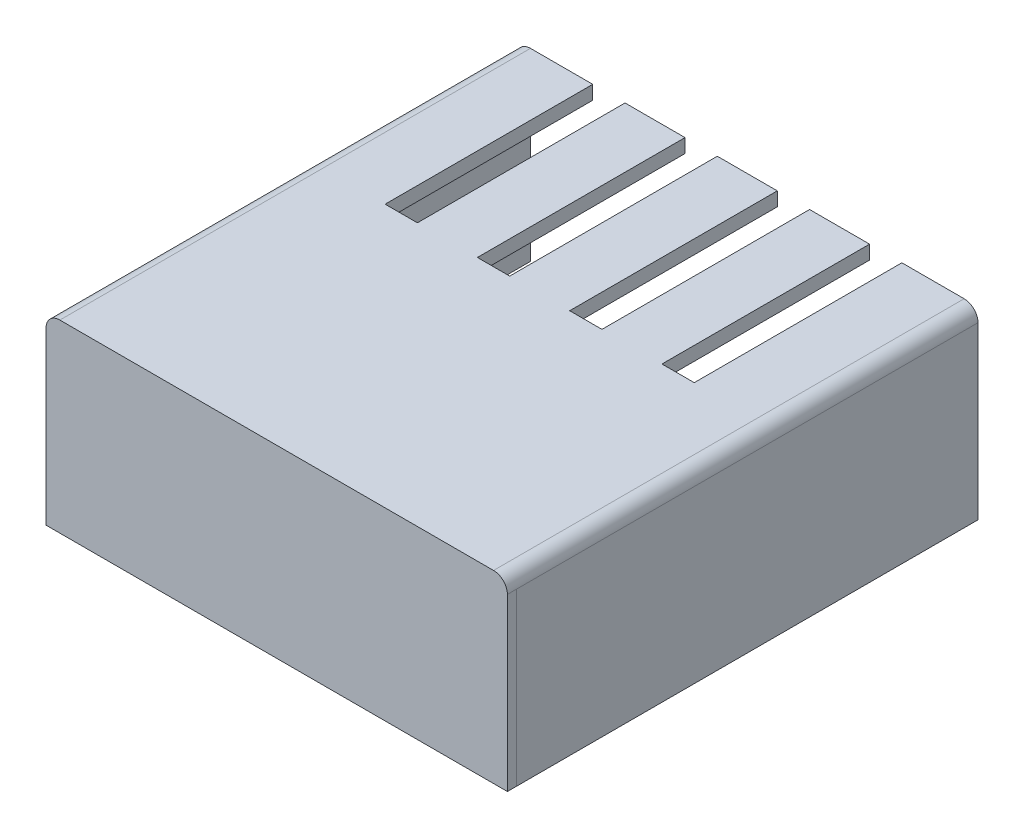
ISO-10303-21;
HEADER;
FILE_DESCRIPTION(('STEP AP214'),'2;1');
FILE_NAME('part.step','',(''),(''),'','','');
FILE_SCHEMA(('AUTOMOTIVE_DESIGN { 1 0 10303 214 1 1 1 1 }'));
ENDSEC;
DATA;
#1=APPLICATION_CONTEXT('core data for automotive mechanical design processes');
#2=APPLICATION_PROTOCOL_DEFINITION('international standard','automotive_design',2000,#1);
#3=PRODUCT_CONTEXT('',#1,'mechanical');
#4=PRODUCT('Part','Part','',(#3));
#5=PRODUCT_RELATED_PRODUCT_CATEGORY('part','',(#4));
#6=PRODUCT_DEFINITION_FORMATION('','',#4);
#7=PRODUCT_DEFINITION_CONTEXT('part definition',#1,'design');
#8=PRODUCT_DEFINITION('design','',#6,#7);
#9=PRODUCT_DEFINITION_SHAPE('','',#8);
#10=(LENGTH_UNIT() NAMED_UNIT(*) SI_UNIT(.MILLI.,.METRE.));
#11=(NAMED_UNIT(*) PLANE_ANGLE_UNIT() SI_UNIT($,.RADIAN.));
#12=(NAMED_UNIT(*) SI_UNIT($,.STERADIAN.) SOLID_ANGLE_UNIT());
#13=UNCERTAINTY_MEASURE_WITH_UNIT(LENGTH_MEASURE(1.E-05),#10,'distance_accuracy_value','');
#14=(GEOMETRIC_REPRESENTATION_CONTEXT(3) GLOBAL_UNCERTAINTY_ASSIGNED_CONTEXT((#13)) GLOBAL_UNIT_ASSIGNED_CONTEXT((#10,
#11,#12)) REPRESENTATION_CONTEXT('',''));
#15=CARTESIAN_POINT('',(0.,0.,0.));
#16=DIRECTION('',(0.,0.,1.));
#17=DIRECTION('',(1.,0.,0.));
#18=AXIS2_PLACEMENT_3D('',#15,#16,#17);
#19=CARTESIAN_POINT('',(47.,0.,30.));
#20=DIRECTION('',(0.,0.,1.));
#21=DIRECTION('',(1.,0.,0.));
#22=AXIS2_PLACEMENT_3D('',#19,#20,#21);
#23=PLANE('',#22);
#24=DIRECTION('',(0.,-1.,0.));
#25=VECTOR('',#24,1.);
#26=CARTESIAN_POINT('',(50.,0.,30.));
#27=LINE('',#26,#25);
#28=CARTESIAN_POINT('',(50.,0.,30.));
#29=VERTEX_POINT('',#28);
#30=CARTESIAN_POINT('',(50.,-37.,30.));
#31=VERTEX_POINT('',#30);
#32=EDGE_CURVE('E107',#29,#31,#27,.T.);
#33=ORIENTED_EDGE('',*,*,#32,.F.);
#34=DIRECTION('',(1.,0.,0.));
#35=VECTOR('',#34,1.);
#36=CARTESIAN_POINT('',(47.,0.,30.));
#37=LINE('',#36,#35);
#38=CARTESIAN_POINT('',(47.,0.,30.));
#39=VERTEX_POINT('',#38);
#40=EDGE_CURVE('E12',#39,#29,#37,.T.);
#41=ORIENTED_EDGE('',*,*,#40,.F.);
#42=DIRECTION('',(0.,-1.,0.));
#43=VECTOR('',#42,1.);
#44=CARTESIAN_POINT('',(47.,0.,30.));
#45=LINE('',#44,#43);
#46=CARTESIAN_POINT('',(47.,-37.,30.));
#47=VERTEX_POINT('',#46);
#48=EDGE_CURVE('E101',#39,#47,#45,.T.);
#49=ORIENTED_EDGE('',*,*,#48,.T.);
#50=DIRECTION('',(1.,0.,0.));
#51=VECTOR('',#50,1.);
#52=CARTESIAN_POINT('',(47.,-37.,30.));
#53=LINE('',#52,#51);
#54=EDGE_CURVE('E46',#47,#31,#53,.T.);
#55=ORIENTED_EDGE('',*,*,#54,.T.);
#56=EDGE_LOOP('',(#33,#41,#49,#55));
#57=FACE_BOUND('',#56,.T.);
#58=ADVANCED_FACE('F43',(#57),#23,.T.);
#59=CARTESIAN_POINT('',(47.,0.,30.));
#60=DIRECTION('',(0.,1.,0.));
#61=DIRECTION('',(0.,0.,1.));
#62=AXIS2_PLACEMENT_3D('',#59,#60,#61);
#63=PLANE('',#62);
#64=DIRECTION('',(0.,0.,1.));
#65=VECTOR('',#64,1.);
#66=CARTESIAN_POINT('',(50.,0.,30.));
#67=LINE('',#66,#65);
#68=CARTESIAN_POINT('',(50.,0.,-70.));
#69=VERTEX_POINT('',#68);
#70=EDGE_CURVE('E103',#69,#29,#67,.T.);
#71=ORIENTED_EDGE('',*,*,#70,.F.);
#72=DIRECTION('',(1.,0.,0.));
#73=VECTOR('',#72,1.);
#74=CARTESIAN_POINT('',(47.,0.,-70.));
#75=LINE('',#74,#73);
#76=CARTESIAN_POINT('',(47.,0.,-70.));
#77=VERTEX_POINT('',#76);
#78=EDGE_CURVE('E52',#77,#69,#75,.T.);
#79=ORIENTED_EDGE('',*,*,#78,.F.);
#80=DIRECTION('',(0.,0.,1.));
#81=VECTOR('',#80,1.);
#82=CARTESIAN_POINT('',(47.,0.,30.));
#83=LINE('',#82,#81);
#84=EDGE_CURVE('E98',#77,#39,#83,.T.);
#85=ORIENTED_EDGE('',*,*,#84,.T.);
#86=ORIENTED_EDGE('',*,*,#40,.T.);
#87=EDGE_LOOP('',(#71,#79,#85,#86));
#88=FACE_BOUND('',#87,.T.);
#89=ADVANCED_FACE('F117',(#88),#63,.T.);
#90=CARTESIAN_POINT('',(47.,0.,-70.));
#91=DIRECTION('',(0.,0.,-1.));
#92=DIRECTION('',(-1.,0.,0.));
#93=AXIS2_PLACEMENT_3D('',#90,#91,#92);
#94=PLANE('',#93);
#95=DIRECTION('',(0.,1.,0.));
#96=VECTOR('',#95,1.);
#97=CARTESIAN_POINT('',(50.,0.,-70.));
#98=LINE('',#97,#96);
#99=CARTESIAN_POINT('',(50.,-37.,-70.));
#100=VERTEX_POINT('',#99);
#101=EDGE_CURVE('E93',#100,#69,#98,.T.);
#102=ORIENTED_EDGE('',*,*,#101,.F.);
#103=DIRECTION('',(1.,0.,0.));
#104=VECTOR('',#103,1.);
#105=CARTESIAN_POINT('',(47.,-37.,-70.));
#106=LINE('',#105,#104);
#107=CARTESIAN_POINT('',(47.,-37.,-70.));
#108=VERTEX_POINT('',#107);
#109=EDGE_CURVE('E88',#108,#100,#106,.T.);
#110=ORIENTED_EDGE('',*,*,#109,.F.);
#111=DIRECTION('',(0.,1.,0.));
#112=VECTOR('',#111,1.);
#113=CARTESIAN_POINT('',(47.,0.,-70.));
#114=LINE('',#113,#112);
#115=EDGE_CURVE('E91',#108,#77,#114,.T.);
#116=ORIENTED_EDGE('',*,*,#115,.T.);
#117=ORIENTED_EDGE('',*,*,#78,.T.);
#118=EDGE_LOOP('',(#102,#110,#116,#117));
#119=FACE_BOUND('',#118,.T.);
#120=ADVANCED_FACE('F90',(#119),#94,.T.);
#121=CARTESIAN_POINT('',(47.,-37.,30.));
#122=DIRECTION('',(0.,-1.,0.));
#123=DIRECTION('',(0.,0.,-1.));
#124=AXIS2_PLACEMENT_3D('',#121,#122,#123);
#125=PLANE('',#124);
#126=DIRECTION('',(0.,0.,-1.));
#127=VECTOR('',#126,1.);
#128=CARTESIAN_POINT('',(50.,-37.,30.));
#129=LINE('',#128,#127);
#130=EDGE_CURVE('E110',#31,#100,#129,.T.);
#131=ORIENTED_EDGE('',*,*,#130,.F.);
#132=ORIENTED_EDGE('',*,*,#54,.F.);
#133=DIRECTION('',(0.,0.,-1.));
#134=VECTOR('',#133,1.);
#135=CARTESIAN_POINT('',(47.,-37.,30.));
#136=LINE('',#135,#134);
#137=EDGE_CURVE('E97',#47,#108,#136,.T.);
#138=ORIENTED_EDGE('',*,*,#137,.T.);
#139=ORIENTED_EDGE('',*,*,#109,.T.);
#140=EDGE_LOOP('',(#131,#132,#138,#139));
#141=FACE_BOUND('',#140,.T.);
#142=ADVANCED_FACE('F100',(#141),#125,.T.);
#143=CARTESIAN_POINT('',(47.,0.,0.));
#144=DIRECTION('',(1.,0.,0.));
#145=DIRECTION('',(0.,0.,-1.));
#146=AXIS2_PLACEMENT_3D('',#143,#144,#145);
#147=PLANE('',#146);
#148=ORIENTED_EDGE('',*,*,#48,.F.);
#149=ORIENTED_EDGE('',*,*,#84,.F.);
#150=ORIENTED_EDGE('',*,*,#115,.F.);
#151=ORIENTED_EDGE('',*,*,#137,.F.);
#152=EDGE_LOOP('',(#148,#149,#150,#151));
#153=FACE_BOUND('',#152,.T.);
#154=ADVANCED_FACE('F96',(#153),#147,.F.);
#155=CARTESIAN_POINT('',(50.,0.,0.));
#156=DIRECTION('',(1.,0.,0.));
#157=DIRECTION('',(0.,0.,-1.));
#158=AXIS2_PLACEMENT_3D('',#155,#156,#157);
#159=PLANE('',#158);
#160=ORIENTED_EDGE('',*,*,#32,.T.);
#161=ORIENTED_EDGE('',*,*,#130,.T.);
#162=ORIENTED_EDGE('',*,*,#101,.T.);
#163=ORIENTED_EDGE('',*,*,#70,.T.);
#164=EDGE_LOOP('',(#160,#161,#162,#163));
#165=FACE_BOUND('',#164,.T.);
#166=ADVANCED_FACE('F116',(#165),#159,.T.);
#167=CLOSED_SHELL('',(#58,#89,#120,#142,#154,#166));
#168=MANIFOLD_SOLID_BREP('B2',#167);
#169=CARTESIAN_POINT('',(-50.,3.,-70.));
#170=DIRECTION('',(0.,0.,1.));
#171=DIRECTION('',(1.,0.,0.));
#172=AXIS2_PLACEMENT_3D('',#169,#170,#171);
#173=PLANE('',#172);
#174=DIRECTION('',(-1.,0.,0.));
#175=VECTOR('',#174,1.);
#176=CARTESIAN_POINT('',(-50.,0.,-70.));
#177=LINE('',#176,#175);
#178=CARTESIAN_POINT('',(-13.5,0.,-70.));
#179=VERTEX_POINT('',#178);
#180=CARTESIAN_POINT('',(-26.5,0.,-70.));
#181=VERTEX_POINT('',#180);
#182=EDGE_CURVE('E659',#179,#181,#177,.T.);
#183=ORIENTED_EDGE('',*,*,#182,.T.);
#184=DIRECTION('',(0.,-1.,0.));
#185=VECTOR('',#184,1.);
#186=CARTESIAN_POINT('',(-26.5,-3.,-70.));
#187=LINE('',#186,#185);
#188=CARTESIAN_POINT('',(-26.5,3.,-70.));
#189=VERTEX_POINT('',#188);
#190=EDGE_CURVE('E401',#189,#181,#187,.T.);
#191=ORIENTED_EDGE('',*,*,#190,.F.);
#192=DIRECTION('',(-1.,0.,0.));
#193=VECTOR('',#192,1.);
#194=CARTESIAN_POINT('',(-50.,3.,-70.));
#195=LINE('',#194,#193);
#196=CARTESIAN_POINT('',(-13.5,3.,-70.));
#197=VERTEX_POINT('',#196);
#198=EDGE_CURVE('E376',#197,#189,#195,.T.);
#199=ORIENTED_EDGE('',*,*,#198,.F.);
#200=DIRECTION('',(0.,1.,0.));
#201=VECTOR('',#200,1.);
#202=CARTESIAN_POINT('',(-13.5,-3.,-70.));
#203=LINE('',#202,#201);
#204=EDGE_CURVE('E390',#179,#197,#203,.T.);
#205=ORIENTED_EDGE('',*,*,#204,.F.);
#206=EDGE_LOOP('',(#183,#191,#199,#205));
#207=FACE_BOUND('',#206,.T.);
#208=ADVANCED_FACE('F167',(#207),#173,.F.);
#209=CARTESIAN_POINT('',(-33.5,3.,-70.));
#210=VERTEX_POINT('',#209);
#211=CARTESIAN_POINT('',(-47.,3.,-70.));
#212=VERTEX_POINT('',#211);
#213=EDGE_CURVE('E523',#210,#212,#195,.T.);
#214=ORIENTED_EDGE('',*,*,#213,.F.);
#215=DIRECTION('',(0.,1.,0.));
#216=VECTOR('',#215,1.);
#217=CARTESIAN_POINT('',(-33.5,-3.,-70.));
#218=LINE('',#217,#216);
#219=CARTESIAN_POINT('',(-33.5,0.,-70.));
#220=VERTEX_POINT('',#219);
#221=EDGE_CURVE('E366',#220,#210,#218,.T.);
#222=ORIENTED_EDGE('',*,*,#221,.F.);
#223=CARTESIAN_POINT('',(-47.,0.,-70.));
#224=VERTEX_POINT('',#223);
#225=EDGE_CURVE('E532',#220,#224,#177,.T.);
#226=ORIENTED_EDGE('',*,*,#225,.T.);
#227=DIRECTION('',(0.,1.,0.));
#228=VECTOR('',#227,1.);
#229=CARTESIAN_POINT('',(-47.,-37.,-70.));
#230=LINE('',#229,#228);
#231=CARTESIAN_POINT('',(-47.,-37.,-70.));
#232=VERTEX_POINT('',#231);
#233=EDGE_CURVE('E488',#232,#224,#230,.T.);
#234=ORIENTED_EDGE('',*,*,#233,.F.);
#235=DIRECTION('',(1.,0.,0.));
#236=VECTOR('',#235,1.);
#237=CARTESIAN_POINT('',(-50.,-37.,-70.));
#238=LINE('',#237,#236);
#239=CARTESIAN_POINT('',(-50.,-37.,-70.));
#240=VERTEX_POINT('',#239);
#241=EDGE_CURVE('E484',#240,#232,#238,.T.);
#242=ORIENTED_EDGE('',*,*,#241,.F.);
#243=DIRECTION('',(0.,-1.,0.));
#244=VECTOR('',#243,1.);
#245=CARTESIAN_POINT('',(-50.,3.,-70.));
#246=LINE('',#245,#244);
#247=CARTESIAN_POINT('',(-50.,0.,-70.));
#248=VERTEX_POINT('',#247);
#249=EDGE_CURVE('E528',#248,#240,#246,.T.);
#250=ORIENTED_EDGE('',*,*,#249,.F.);
#251=CARTESIAN_POINT('',(-47.,0.,-70.));
#252=DIRECTION('',(0.,0.,1.));
#253=DIRECTION('',(1.,0.,0.));
#254=AXIS2_PLACEMENT_3D('',#251,#252,#253);
#255=CIRCLE('',#254,3.);
#256=EDGE_CURVE('E555',#248,#212,#255,.F.);
#257=ORIENTED_EDGE('',*,*,#256,.T.);
#258=EDGE_LOOP('',(#214,#222,#226,#234,#242,#250,#257));
#259=FACE_BOUND('',#258,.T.);
#260=ADVANCED_FACE('F590',(#259),#173,.F.);
#261=CARTESIAN_POINT('',(6.49999999999998,0.,-70.));
#262=VERTEX_POINT('',#261);
#263=CARTESIAN_POINT('',(-6.50000000000001,0.,-70.));
#264=VERTEX_POINT('',#263);
#265=EDGE_CURVE('E648',#262,#264,#177,.T.);
#266=ORIENTED_EDGE('',*,*,#265,.T.);
#267=DIRECTION('',(0.,-1.,0.));
#268=VECTOR('',#267,1.);
#269=CARTESIAN_POINT('',(-6.50000000000001,-3.,-70.));
#270=LINE('',#269,#268);
#271=CARTESIAN_POINT('',(-6.50000000000001,3.,-70.));
#272=VERTEX_POINT('',#271);
#273=EDGE_CURVE('E396',#272,#264,#270,.T.);
#274=ORIENTED_EDGE('',*,*,#273,.F.);
#275=CARTESIAN_POINT('',(6.49999999999998,3.,-70.));
#276=VERTEX_POINT('',#275);
#277=EDGE_CURVE('E620',#276,#272,#195,.T.);
#278=ORIENTED_EDGE('',*,*,#277,.F.);
#279=DIRECTION('',(0.,1.,0.));
#280=VECTOR('',#279,1.);
#281=CARTESIAN_POINT('',(6.49999999999998,-3.,-70.));
#282=LINE('',#281,#280);
#283=EDGE_CURVE('E407',#262,#276,#282,.T.);
#284=ORIENTED_EDGE('',*,*,#283,.F.);
#285=EDGE_LOOP('',(#266,#274,#278,#284));
#286=FACE_BOUND('',#285,.T.);
#287=ADVANCED_FACE('F647',(#286),#173,.F.);
#288=CARTESIAN_POINT('',(26.5,0.,-70.));
#289=VERTEX_POINT('',#288);
#290=CARTESIAN_POINT('',(13.5,0.,-70.));
#291=VERTEX_POINT('',#290);
#292=EDGE_CURVE('E535',#289,#291,#177,.T.);
#293=ORIENTED_EDGE('',*,*,#292,.T.);
#294=DIRECTION('',(0.,-1.,0.));
#295=VECTOR('',#294,1.);
#296=CARTESIAN_POINT('',(13.5,-3.,-70.));
#297=LINE('',#296,#295);
#298=CARTESIAN_POINT('',(13.5,3.,-70.));
#299=VERTEX_POINT('',#298);
#300=EDGE_CURVE('E414',#299,#291,#297,.T.);
#301=ORIENTED_EDGE('',*,*,#300,.F.);
#302=CARTESIAN_POINT('',(26.5,3.,-70.));
#303=VERTEX_POINT('',#302);
#304=EDGE_CURVE('E529',#303,#299,#195,.T.);
#305=ORIENTED_EDGE('',*,*,#304,.F.);
#306=DIRECTION('',(0.,1.,0.));
#307=VECTOR('',#306,1.);
#308=CARTESIAN_POINT('',(26.5,-3.,-70.));
#309=LINE('',#308,#307);
#310=EDGE_CURVE('E425',#289,#303,#309,.T.);
#311=ORIENTED_EDGE('',*,*,#310,.F.);
#312=EDGE_LOOP('',(#293,#301,#305,#311));
#313=FACE_BOUND('',#312,.T.);
#314=ADVANCED_FACE('F633',(#313),#173,.F.);
#315=CARTESIAN_POINT('',(0.,0.,0.));
#316=DIRECTION('',(0.,1.,0.));
#317=DIRECTION('',(0.,0.,1.));
#318=AXIS2_PLACEMENT_3D('',#315,#316,#317);
#319=PLANE('',#318);
#320=DIRECTION('',(-1.,0.,0.));
#321=VECTOR('',#320,1.);
#322=CARTESIAN_POINT('',(0.,0.,-25.));
#323=LINE('',#322,#321);
#324=CARTESIAN_POINT('',(-26.5,0.,-25.));
#325=VERTEX_POINT('',#324);
#326=CARTESIAN_POINT('',(-33.5,0.,-25.));
#327=VERTEX_POINT('',#326);
#328=EDGE_CURVE('E461',#325,#327,#323,.T.);
#329=ORIENTED_EDGE('',*,*,#328,.F.);
#330=DIRECTION('',(0.,0.,-1.));
#331=VECTOR('',#330,1.);
#332=CARTESIAN_POINT('',(-26.5,0.,0.));
#333=LINE('',#332,#331);
#334=EDGE_CURVE('E362',#325,#181,#333,.T.);
#335=ORIENTED_EDGE('',*,*,#334,.T.);
#336=ORIENTED_EDGE('',*,*,#182,.F.);
#337=DIRECTION('',(0.,0.,1.));
#338=VECTOR('',#337,1.);
#339=CARTESIAN_POINT('',(-13.5,0.,0.));
#340=LINE('',#339,#338);
#341=CARTESIAN_POINT('',(-13.5,0.,-25.));
#342=VERTEX_POINT('',#341);
#343=EDGE_CURVE('E458',#179,#342,#340,.T.);
#344=ORIENTED_EDGE('',*,*,#343,.T.);
#345=DIRECTION('',(1.,0.,0.));
#346=VECTOR('',#345,1.);
#347=CARTESIAN_POINT('',(0.,0.,-25.));
#348=LINE('',#347,#346);
#349=CARTESIAN_POINT('',(-6.50000000000001,0.,-25.));
#350=VERTEX_POINT('',#349);
#351=EDGE_CURVE('E452',#342,#350,#348,.T.);
#352=ORIENTED_EDGE('',*,*,#351,.T.);
#353=DIRECTION('',(0.,0.,-1.));
#354=VECTOR('',#353,1.);
#355=CARTESIAN_POINT('',(-6.50000000000001,0.,0.));
#356=LINE('',#355,#354);
#357=EDGE_CURVE('E455',#350,#264,#356,.T.);
#358=ORIENTED_EDGE('',*,*,#357,.T.);
#359=ORIENTED_EDGE('',*,*,#265,.F.);
#360=DIRECTION('',(0.,0.,1.));
#361=VECTOR('',#360,1.);
#362=CARTESIAN_POINT('',(6.49999999999998,0.,0.));
#363=LINE('',#362,#361);
#364=CARTESIAN_POINT('',(6.49999999999998,0.,-25.));
#365=VERTEX_POINT('',#364);
#366=EDGE_CURVE('E449',#262,#365,#363,.T.);
#367=ORIENTED_EDGE('',*,*,#366,.T.);
#368=DIRECTION('',(1.,0.,0.));
#369=VECTOR('',#368,1.);
#370=CARTESIAN_POINT('',(0.,0.,-25.));
#371=LINE('',#370,#369);
#372=CARTESIAN_POINT('',(13.5,0.,-25.));
#373=VERTEX_POINT('',#372);
#374=EDGE_CURVE('E443',#365,#373,#371,.T.);
#375=ORIENTED_EDGE('',*,*,#374,.T.);
#376=DIRECTION('',(0.,0.,-1.));
#377=VECTOR('',#376,1.);
#378=CARTESIAN_POINT('',(13.5,0.,0.));
#379=LINE('',#378,#377);
#380=EDGE_CURVE('E446',#373,#291,#379,.T.);
#381=ORIENTED_EDGE('',*,*,#380,.T.);
#382=ORIENTED_EDGE('',*,*,#292,.F.);
#383=DIRECTION('',(0.,0.,1.));
#384=VECTOR('',#383,1.);
#385=CARTESIAN_POINT('',(26.5,0.,0.));
#386=LINE('',#385,#384);
#387=CARTESIAN_POINT('',(26.5,0.,-25.));
#388=VERTEX_POINT('',#387);
#389=EDGE_CURVE('E440',#289,#388,#386,.T.);
#390=ORIENTED_EDGE('',*,*,#389,.T.);
#391=DIRECTION('',(1.,0.,0.));
#392=VECTOR('',#391,1.);
#393=CARTESIAN_POINT('',(0.,0.,-25.));
#394=LINE('',#393,#392);
#395=CARTESIAN_POINT('',(33.5,0.,-25.));
#396=VERTEX_POINT('',#395);
#397=EDGE_CURVE('E377',#388,#396,#394,.T.);
#398=ORIENTED_EDGE('',*,*,#397,.T.);
#399=DIRECTION('',(0.,0.,-1.));
#400=VECTOR('',#399,1.);
#401=CARTESIAN_POINT('',(33.5,0.,0.));
#402=LINE('',#401,#400);
#403=CARTESIAN_POINT('',(33.5,0.,-70.));
#404=VERTEX_POINT('',#403);
#405=EDGE_CURVE('E380',#396,#404,#402,.T.);
#406=ORIENTED_EDGE('',*,*,#405,.T.);
#407=CARTESIAN_POINT('',(50.,0.,-70.));
#408=VERTEX_POINT('',#407);
#409=EDGE_CURVE('E524',#408,#404,#177,.T.);
#410=ORIENTED_EDGE('',*,*,#409,.F.);
#411=DIRECTION('',(0.,0.,-1.));
#412=VECTOR('',#411,1.);
#413=CARTESIAN_POINT('',(50.,0.,-70.));
#414=LINE('',#413,#412);
#415=CARTESIAN_POINT('',(50.,0.,30.));
#416=VERTEX_POINT('',#415);
#417=EDGE_CURVE('E519',#416,#408,#414,.T.);
#418=ORIENTED_EDGE('',*,*,#417,.F.);
#419=DIRECTION('',(-1.,0.,0.));
#420=VECTOR('',#419,1.);
#421=CARTESIAN_POINT('',(-47.,0.,30.));
#422=LINE('',#421,#420);
#423=CARTESIAN_POINT('',(-47.,0.,30.));
#424=VERTEX_POINT('',#423);
#425=EDGE_CURVE('E475',#416,#424,#422,.T.);
#426=ORIENTED_EDGE('',*,*,#425,.T.);
#427=DIRECTION('',(0.,0.,1.));
#428=VECTOR('',#427,1.);
#429=CARTESIAN_POINT('',(-47.,0.,-14.5));
#430=LINE('',#429,#428);
#431=EDGE_CURVE('E501',#224,#424,#430,.T.);
#432=ORIENTED_EDGE('',*,*,#431,.F.);
#433=ORIENTED_EDGE('',*,*,#225,.F.);
#434=DIRECTION('',(0.,0.,1.));
#435=VECTOR('',#434,1.);
#436=CARTESIAN_POINT('',(-33.5,0.,0.));
#437=LINE('',#436,#435);
#438=EDGE_CURVE('E463',#220,#327,#437,.T.);
#439=ORIENTED_EDGE('',*,*,#438,.T.);
#440=EDGE_LOOP('',(#329,#335,#336,#344,#352,#358,#359,#367,#375,#381,#382,#390,#398,#406,#410,
#418,#426,#432,#433,#439));
#441=FACE_BOUND('',#440,.T.);
#442=ADVANCED_FACE('F595',(#441),#319,.F.);
#443=CARTESIAN_POINT('',(-47.,-50.,-14.5));
#444=DIRECTION('',(-1.,0.,0.));
#445=DIRECTION('',(0.,0.,1.));
#446=AXIS2_PLACEMENT_3D('',#443,#444,#445);
#447=PLANE('',#446);
#448=DIRECTION('',(0.,0.,1.));
#449=VECTOR('',#448,1.);
#450=CARTESIAN_POINT('',(-47.,-50.,-14.5));
#451=LINE('',#450,#449);
#452=CARTESIAN_POINT('',(-47.,-50.,-26.5));
#453=VERTEX_POINT('',#452);
#454=CARTESIAN_POINT('',(-47.,-50.,-14.5));
#455=VERTEX_POINT('',#454);
#456=EDGE_CURVE('E504',#453,#455,#451,.T.);
#457=ORIENTED_EDGE('',*,*,#456,.F.);
#458=DIRECTION('',(0.,1.,0.));
#459=VECTOR('',#458,1.);
#460=CARTESIAN_POINT('',(-47.,-50.,-26.5));
#461=LINE('',#460,#459);
#462=CARTESIAN_POINT('',(-47.,-37.,-26.5));
#463=VERTEX_POINT('',#462);
#464=EDGE_CURVE('E560',#453,#463,#461,.T.);
#465=ORIENTED_EDGE('',*,*,#464,.T.);
#466=DIRECTION('',(0.,0.,1.));
#467=VECTOR('',#466,1.);
#468=CARTESIAN_POINT('',(-47.,-37.,-29.5));
#469=LINE('',#468,#467);
#470=EDGE_CURVE('E486',#232,#463,#469,.T.);
#471=ORIENTED_EDGE('',*,*,#470,.F.);
#472=ORIENTED_EDGE('',*,*,#233,.T.);
#473=ORIENTED_EDGE('',*,*,#431,.T.);
#474=DIRECTION('',(0.,-1.,0.));
#475=VECTOR('',#474,1.);
#476=CARTESIAN_POINT('',(-47.,0.,30.));
#477=LINE('',#476,#475);
#478=CARTESIAN_POINT('',(-47.,-37.,30.));
#479=VERTEX_POINT('',#478);
#480=EDGE_CURVE('E467',#424,#479,#477,.T.);
#481=ORIENTED_EDGE('',*,*,#480,.T.);
#482=DIRECTION('',(0.,0.,1.));
#483=VECTOR('',#482,1.);
#484=CARTESIAN_POINT('',(-47.,-37.,-14.5));
#485=LINE('',#484,#483);
#486=CARTESIAN_POINT('',(-47.,-37.,-14.5));
#487=VERTEX_POINT('',#486);
#488=EDGE_CURVE('E491',#487,#479,#485,.T.);
#489=ORIENTED_EDGE('',*,*,#488,.F.);
#490=DIRECTION('',(0.,1.,0.));
#491=VECTOR('',#490,1.);
#492=CARTESIAN_POINT('',(-47.,-50.,-14.5));
#493=LINE('',#492,#491);
#494=EDGE_CURVE('E513',#455,#487,#493,.T.);
#495=ORIENTED_EDGE('',*,*,#494,.F.);
#496=EDGE_LOOP('',(#457,#465,#471,#472,#473,#481,#489,#495));
#497=FACE_BOUND('',#496,.T.);
#498=ADVANCED_FACE('F572',(#497),#447,.F.);
#499=CARTESIAN_POINT('',(-50.,3.,-70.));
#500=DIRECTION('',(1.,0.,0.));
#501=DIRECTION('',(0.,0.,-1.));
#502=AXIS2_PLACEMENT_3D('',#499,#500,#501);
#503=PLANE('',#502);
#504=DIRECTION('',(0.,-1.,0.));
#505=VECTOR('',#504,1.);
#506=CARTESIAN_POINT('',(-50.,3.,32.));
#507=LINE('',#506,#505);
#508=CARTESIAN_POINT('',(-50.,0.,32.));
#509=VERTEX_POINT('',#508);
#510=CARTESIAN_POINT('',(-50.,-37.,32.));
#511=VERTEX_POINT('',#510);
#512=EDGE_CURVE('E539',#509,#511,#507,.T.);
#513=ORIENTED_EDGE('',*,*,#512,.F.);
#514=DIRECTION('',(0.,0.,1.));
#515=VECTOR('',#514,1.);
#516=CARTESIAN_POINT('',(-50.,0.,-70.));
#517=LINE('',#516,#515);
#518=EDGE_CURVE('E551',#509,#248,#517,.F.);
#519=ORIENTED_EDGE('',*,*,#518,.T.);
#520=ORIENTED_EDGE('',*,*,#249,.T.);
#521=DIRECTION('',(0.,0.,-1.));
#522=VECTOR('',#521,1.);
#523=CARTESIAN_POINT('',(-50.,-37.,-29.5));
#524=LINE('',#523,#522);
#525=CARTESIAN_POINT('',(-50.,-37.,-29.5));
#526=VERTEX_POINT('',#525);
#527=EDGE_CURVE('E481',#526,#240,#524,.T.);
#528=ORIENTED_EDGE('',*,*,#527,.F.);
#529=DIRECTION('',(0.,1.,0.));
#530=VECTOR('',#529,1.);
#531=CARTESIAN_POINT('',(-50.,-50.,-29.5));
#532=LINE('',#531,#530);
#533=CARTESIAN_POINT('',(-50.,-50.,-29.5));
#534=VERTEX_POINT('',#533);
#535=EDGE_CURVE('E516',#534,#526,#532,.T.);
#536=ORIENTED_EDGE('',*,*,#535,.F.);
#537=DIRECTION('',(0.,0.,-1.));
#538=VECTOR('',#537,1.);
#539=CARTESIAN_POINT('',(-50.,-50.,-14.5));
#540=LINE('',#539,#538);
#541=CARTESIAN_POINT('',(-50.,-50.,-14.5));
#542=VERTEX_POINT('',#541);
#543=EDGE_CURVE('E502',#542,#534,#540,.T.);
#544=ORIENTED_EDGE('',*,*,#543,.F.);
#545=DIRECTION('',(0.,1.,0.));
#546=VECTOR('',#545,1.);
#547=CARTESIAN_POINT('',(-50.,-50.,-14.5));
#548=LINE('',#547,#546);
#549=CARTESIAN_POINT('',(-50.,-37.,-14.5));
#550=VERTEX_POINT('',#549);
#551=EDGE_CURVE('E508',#542,#550,#548,.T.);
#552=ORIENTED_EDGE('',*,*,#551,.T.);
#553=DIRECTION('',(0.,0.,-1.));
#554=VECTOR('',#553,1.);
#555=CARTESIAN_POINT('',(-50.,-37.,-14.5));
#556=LINE('',#555,#554);
#557=EDGE_CURVE('E497',#511,#550,#556,.T.);
#558=ORIENTED_EDGE('',*,*,#557,.F.);
#559=EDGE_LOOP('',(#513,#519,#520,#528,#536,#544,#552,#558));
#560=FACE_BOUND('',#559,.T.);
#561=ADVANCED_FACE('F582',(#560),#503,.F.);
#562=CARTESIAN_POINT('',(-50.,3.,32.));
#563=DIRECTION('',(0.,0.,-1.));
#564=DIRECTION('',(-1.,0.,0.));
#565=AXIS2_PLACEMENT_3D('',#562,#563,#564);
#566=PLANE('',#565);
#567=DIRECTION('',(1.,0.,0.));
#568=VECTOR('',#567,1.);
#569=CARTESIAN_POINT('',(-50.,3.,32.));
#570=LINE('',#569,#568);
#571=CARTESIAN_POINT('',(-47.,3.,32.));
#572=VERTEX_POINT('',#571);
#573=CARTESIAN_POINT('',(47.,3.,32.));
#574=VERTEX_POINT('',#573);
#575=EDGE_CURVE('E520',#572,#574,#570,.T.);
#576=ORIENTED_EDGE('',*,*,#575,.F.);
#577=CARTESIAN_POINT('',(-47.,0.,32.));
#578=DIRECTION('',(0.,0.,-1.));
#579=DIRECTION('',(-1.,0.,0.));
#580=AXIS2_PLACEMENT_3D('',#577,#578,#579);
#581=CIRCLE('',#580,3.);
#582=EDGE_CURVE('E549',#572,#509,#581,.F.);
#583=ORIENTED_EDGE('',*,*,#582,.T.);
#584=ORIENTED_EDGE('',*,*,#512,.T.);
#585=DIRECTION('',(-1.,0.,0.));
#586=VECTOR('',#585,1.);
#587=CARTESIAN_POINT('',(-47.,-37.,32.));
#588=LINE('',#587,#586);
#589=CARTESIAN_POINT('',(50.,-37.,32.));
#590=VERTEX_POINT('',#589);
#591=EDGE_CURVE('E494',#590,#511,#588,.T.);
#592=ORIENTED_EDGE('',*,*,#591,.F.);
#593=DIRECTION('',(0.,-1.,0.));
#594=VECTOR('',#593,1.);
#595=CARTESIAN_POINT('',(50.,3.,32.));
#596=LINE('',#595,#594);
#597=CARTESIAN_POINT('',(50.,0.,32.));
#598=VERTEX_POINT('',#597);
#599=EDGE_CURVE('E537',#598,#590,#596,.T.);
#600=ORIENTED_EDGE('',*,*,#599,.F.);
#601=CARTESIAN_POINT('',(47.,0.,32.));
#602=DIRECTION('',(0.,0.,-1.));
#603=DIRECTION('',(-1.,0.,0.));
#604=AXIS2_PLACEMENT_3D('',#601,#602,#603);
#605=CIRCLE('',#604,3.);
#606=EDGE_CURVE('E547',#598,#574,#605,.F.);
#607=ORIENTED_EDGE('',*,*,#606,.T.);
#608=EDGE_LOOP('',(#576,#583,#584,#592,#600,#607));
#609=FACE_BOUND('',#608,.T.);
#610=ADVANCED_FACE('F614',(#609),#566,.F.);
#611=CARTESIAN_POINT('',(50.,3.,-70.));
#612=DIRECTION('',(-1.,0.,0.));
#613=DIRECTION('',(0.,0.,1.));
#614=AXIS2_PLACEMENT_3D('',#611,#612,#613);
#615=PLANE('',#614);
#616=DIRECTION('',(0.,1.,0.));
#617=VECTOR('',#616,1.);
#618=CARTESIAN_POINT('',(50.,0.,30.));
#619=LINE('',#618,#617);
#620=CARTESIAN_POINT('',(50.,-37.,30.));
#621=VERTEX_POINT('',#620);
#622=EDGE_CURVE('E473',#621,#416,#619,.T.);
#623=ORIENTED_EDGE('',*,*,#622,.T.);
#624=DIRECTION('',(0.,0.,-1.));
#625=VECTOR('',#624,1.);
#626=CARTESIAN_POINT('',(50.,0.,32.));
#627=LINE('',#626,#625);
#628=EDGE_CURVE('E558',#416,#598,#627,.F.);
#629=ORIENTED_EDGE('',*,*,#628,.T.);
#630=ORIENTED_EDGE('',*,*,#599,.T.);
#631=DIRECTION('',(0.,0.,1.));
#632=VECTOR('',#631,1.);
#633=CARTESIAN_POINT('',(50.,-37.,30.));
#634=LINE('',#633,#632);
#635=EDGE_CURVE('E478',#621,#590,#634,.T.);
#636=ORIENTED_EDGE('',*,*,#635,.F.);
#637=EDGE_LOOP('',(#623,#629,#630,#636));
#638=FACE_BOUND('',#637,.T.);
#639=ADVANCED_FACE('F679',(#638),#615,.F.);
#640=ORIENTED_EDGE('',*,*,#409,.T.);
#641=DIRECTION('',(0.,-1.,0.));
#642=VECTOR('',#641,1.);
#643=CARTESIAN_POINT('',(33.5,-3.,-70.));
#644=LINE('',#643,#642);
#645=CARTESIAN_POINT('',(33.5,3.,-70.));
#646=VERTEX_POINT('',#645);
#647=EDGE_CURVE('E432',#646,#404,#644,.T.);
#648=ORIENTED_EDGE('',*,*,#647,.F.);
#649=CARTESIAN_POINT('',(47.,3.,-70.));
#650=VERTEX_POINT('',#649);
#651=EDGE_CURVE('E525',#650,#646,#195,.T.);
#652=ORIENTED_EDGE('',*,*,#651,.F.);
#653=CARTESIAN_POINT('',(47.,0.,-70.));
#654=DIRECTION('',(0.,0.,1.));
#655=DIRECTION('',(1.,0.,0.));
#656=AXIS2_PLACEMENT_3D('',#653,#654,#655);
#657=CIRCLE('',#656,3.);
#658=EDGE_CURVE('E553',#650,#408,#657,.F.);
#659=ORIENTED_EDGE('',*,*,#658,.T.);
#660=EDGE_LOOP('',(#640,#648,#652,#659));
#661=FACE_BOUND('',#660,.T.);
#662=ADVANCED_FACE('F672',(#661),#173,.F.);
#663=CARTESIAN_POINT('',(0.,3.,0.));
#664=DIRECTION('',(0.,1.,0.));
#665=DIRECTION('',(0.,0.,1.));
#666=AXIS2_PLACEMENT_3D('',#663,#664,#665);
#667=PLANE('',#666);
#668=DIRECTION('',(0.,0.,-1.));
#669=VECTOR('',#668,1.);
#670=CARTESIAN_POINT('',(-26.5,3.,-25.));
#671=LINE('',#670,#669);
#672=CARTESIAN_POINT('',(-26.5,3.,-25.));
#673=VERTEX_POINT('',#672);
#674=EDGE_CURVE('E359',#673,#189,#671,.T.);
#675=ORIENTED_EDGE('',*,*,#674,.F.);
#676=DIRECTION('',(1.,0.,0.));
#677=VECTOR('',#676,1.);
#678=CARTESIAN_POINT('',(-33.5,3.,-25.));
#679=LINE('',#678,#677);
#680=CARTESIAN_POINT('',(-33.5,3.,-25.));
#681=VERTEX_POINT('',#680);
#682=EDGE_CURVE('E369',#681,#673,#679,.T.);
#683=ORIENTED_EDGE('',*,*,#682,.F.);
#684=DIRECTION('',(0.,0.,-1.));
#685=VECTOR('',#684,1.);
#686=CARTESIAN_POINT('',(-33.5,3.,-25.));
#687=LINE('',#686,#685);
#688=EDGE_CURVE('E182',#681,#210,#687,.T.);
#689=ORIENTED_EDGE('',*,*,#688,.T.);
#690=ORIENTED_EDGE('',*,*,#213,.T.);
#691=DIRECTION('',(0.,0.,1.));
#692=VECTOR('',#691,1.);
#693=CARTESIAN_POINT('',(-47.,3.,32.));
#694=LINE('',#693,#692);
#695=EDGE_CURVE('E544',#212,#572,#694,.T.);
#696=ORIENTED_EDGE('',*,*,#695,.T.);
#697=ORIENTED_EDGE('',*,*,#575,.T.);
#698=DIRECTION('',(0.,0.,-1.));
#699=VECTOR('',#698,1.);
#700=CARTESIAN_POINT('',(47.,3.,-70.));
#701=LINE('',#700,#699);
#702=EDGE_CURVE('E541',#574,#650,#701,.T.);
#703=ORIENTED_EDGE('',*,*,#702,.T.);
#704=ORIENTED_EDGE('',*,*,#651,.T.);
#705=DIRECTION('',(0.,0.,-1.));
#706=VECTOR('',#705,1.);
#707=CARTESIAN_POINT('',(33.5,3.,-25.));
#708=LINE('',#707,#706);
#709=CARTESIAN_POINT('',(33.5,3.,-25.));
#710=VERTEX_POINT('',#709);
#711=EDGE_CURVE('E431',#710,#646,#708,.T.);
#712=ORIENTED_EDGE('',*,*,#711,.F.);
#713=DIRECTION('',(1.,0.,0.));
#714=VECTOR('',#713,1.);
#715=CARTESIAN_POINT('',(26.5,3.,-25.));
#716=LINE('',#715,#714);
#717=CARTESIAN_POINT('',(26.5,3.,-25.));
#718=VERTEX_POINT('',#717);
#719=EDGE_CURVE('E421',#718,#710,#716,.T.);
#720=ORIENTED_EDGE('',*,*,#719,.F.);
#721=DIRECTION('',(0.,0.,-1.));
#722=VECTOR('',#721,1.);
#723=CARTESIAN_POINT('',(26.5,3.,-25.));
#724=LINE('',#723,#722);
#725=EDGE_CURVE('E416',#718,#303,#724,.T.);
#726=ORIENTED_EDGE('',*,*,#725,.T.);
#727=ORIENTED_EDGE('',*,*,#304,.T.);
#728=DIRECTION('',(0.,0.,-1.));
#729=VECTOR('',#728,1.);
#730=CARTESIAN_POINT('',(13.5,3.,-25.));
#731=LINE('',#730,#729);
#732=CARTESIAN_POINT('',(13.5,3.,-25.));
#733=VERTEX_POINT('',#732);
#734=EDGE_CURVE('E413',#733,#299,#731,.T.);
#735=ORIENTED_EDGE('',*,*,#734,.F.);
#736=DIRECTION('',(1.,0.,0.));
#737=VECTOR('',#736,1.);
#738=CARTESIAN_POINT('',(6.49999999999998,3.,-25.));
#739=LINE('',#738,#737);
#740=CARTESIAN_POINT('',(6.49999999999998,3.,-25.));
#741=VERTEX_POINT('',#740);
#742=EDGE_CURVE('E403',#741,#733,#739,.T.);
#743=ORIENTED_EDGE('',*,*,#742,.F.);
#744=DIRECTION('',(0.,0.,-1.));
#745=VECTOR('',#744,1.);
#746=CARTESIAN_POINT('',(6.49999999999998,3.,-25.));
#747=LINE('',#746,#745);
#748=EDGE_CURVE('E398',#741,#276,#747,.T.);
#749=ORIENTED_EDGE('',*,*,#748,.T.);
#750=ORIENTED_EDGE('',*,*,#277,.T.);
#751=DIRECTION('',(0.,0.,-1.));
#752=VECTOR('',#751,1.);
#753=CARTESIAN_POINT('',(-6.50000000000001,3.,-25.));
#754=LINE('',#753,#752);
#755=CARTESIAN_POINT('',(-6.50000000000001,3.,-25.));
#756=VERTEX_POINT('',#755);
#757=EDGE_CURVE('E395',#756,#272,#754,.T.);
#758=ORIENTED_EDGE('',*,*,#757,.F.);
#759=DIRECTION('',(1.,0.,0.));
#760=VECTOR('',#759,1.);
#761=CARTESIAN_POINT('',(-13.5,3.,-25.));
#762=LINE('',#761,#760);
#763=CARTESIAN_POINT('',(-13.5,3.,-25.));
#764=VERTEX_POINT('',#763);
#765=EDGE_CURVE('E386',#764,#756,#762,.T.);
#766=ORIENTED_EDGE('',*,*,#765,.F.);
#767=DIRECTION('',(0.,0.,-1.));
#768=VECTOR('',#767,1.);
#769=CARTESIAN_POINT('',(-13.5,3.,-25.));
#770=LINE('',#769,#768);
#771=EDGE_CURVE('E190',#764,#197,#770,.T.);
#772=ORIENTED_EDGE('',*,*,#771,.T.);
#773=ORIENTED_EDGE('',*,*,#198,.T.);
#774=EDGE_LOOP('',(#675,#683,#689,#690,#696,#697,#703,#704,#712,#720,#726,#727,#735,#743,#749,
#750,#758,#766,#772,#773));
#775=FACE_BOUND('',#774,.T.);
#776=ADVANCED_FACE('F374',(#775),#667,.T.);
#777=CARTESIAN_POINT('',(-50.,-50.,-14.5));
#778=DIRECTION('',(0.,0.,-1.));
#779=DIRECTION('',(-1.,0.,0.));
#780=AXIS2_PLACEMENT_3D('',#777,#778,#779);
#781=PLANE('',#780);
#782=ORIENTED_EDGE('',*,*,#494,.T.);
#783=DIRECTION('',(1.,0.,0.));
#784=VECTOR('',#783,1.);
#785=CARTESIAN_POINT('',(-47.,-37.,-14.5));
#786=LINE('',#785,#784);
#787=EDGE_CURVE('E499',#550,#487,#786,.T.);
#788=ORIENTED_EDGE('',*,*,#787,.F.);
#789=ORIENTED_EDGE('',*,*,#551,.F.);
#790=DIRECTION('',(-1.,0.,0.));
#791=VECTOR('',#790,1.);
#792=CARTESIAN_POINT('',(-50.,-50.,-14.5));
#793=LINE('',#792,#791);
#794=EDGE_CURVE('E506',#455,#542,#793,.T.);
#795=ORIENTED_EDGE('',*,*,#794,.F.);
#796=EDGE_LOOP('',(#782,#788,#789,#795));
#797=FACE_BOUND('',#796,.T.);
#798=ADVANCED_FACE('F607',(#797),#781,.F.);
#799=CARTESIAN_POINT('',(0.,-50.,0.));
#800=DIRECTION('',(0.,-1.,0.));
#801=DIRECTION('',(0.,0.,-1.));
#802=AXIS2_PLACEMENT_3D('',#799,#800,#801);
#803=PLANE('',#802);
#804=ORIENTED_EDGE('',*,*,#543,.T.);
#805=CARTESIAN_POINT('',(-50.,-50.,-26.5));
#806=DIRECTION('',(0.,-1.,0.));
#807=DIRECTION('',(0.,0.,-1.));
#808=AXIS2_PLACEMENT_3D('',#805,#806,#807);
#809=CIRCLE('',#808,3.);
#810=EDGE_CURVE('E175',#534,#453,#809,.T.);
#811=ORIENTED_EDGE('',*,*,#810,.T.);
#812=ORIENTED_EDGE('',*,*,#456,.T.);
#813=ORIENTED_EDGE('',*,*,#794,.T.);
#814=EDGE_LOOP('',(#804,#811,#812,#813));
#815=FACE_BOUND('',#814,.T.);
#816=ADVANCED_FACE('F565',(#815),#803,.T.);
#817=CARTESIAN_POINT('',(0.,-37.,0.));
#818=DIRECTION('',(0.,-1.,0.));
#819=DIRECTION('',(0.,0.,-1.));
#820=AXIS2_PLACEMENT_3D('',#817,#818,#819);
#821=PLANE('',#820);
#822=ORIENTED_EDGE('',*,*,#488,.T.);
#823=DIRECTION('',(1.,0.,0.));
#824=VECTOR('',#823,1.);
#825=CARTESIAN_POINT('',(-47.,-37.,30.));
#826=LINE('',#825,#824);
#827=EDGE_CURVE('E470',#479,#621,#826,.T.);
#828=ORIENTED_EDGE('',*,*,#827,.T.);
#829=ORIENTED_EDGE('',*,*,#635,.T.);
#830=ORIENTED_EDGE('',*,*,#591,.T.);
#831=ORIENTED_EDGE('',*,*,#557,.T.);
#832=ORIENTED_EDGE('',*,*,#787,.T.);
#833=EDGE_LOOP('',(#822,#828,#829,#830,#831,#832));
#834=FACE_BOUND('',#833,.T.);
#835=ADVANCED_FACE('F604',(#834),#821,.T.);
#836=CARTESIAN_POINT('',(0.,-37.,0.));
#837=DIRECTION('',(0.,-1.,0.));
#838=DIRECTION('',(0.,0.,-1.));
#839=AXIS2_PLACEMENT_3D('',#836,#837,#838);
#840=PLANE('',#839);
#841=ORIENTED_EDGE('',*,*,#527,.T.);
#842=ORIENTED_EDGE('',*,*,#241,.T.);
#843=ORIENTED_EDGE('',*,*,#470,.T.);
#844=CARTESIAN_POINT('',(-50.,-37.,-26.5));
#845=DIRECTION('',(0.,-1.,0.));
#846=DIRECTION('',(0.,0.,-1.));
#847=AXIS2_PLACEMENT_3D('',#844,#845,#846);
#848=CIRCLE('',#847,3.);
#849=EDGE_CURVE('E41',#463,#526,#848,.F.);
#850=ORIENTED_EDGE('',*,*,#849,.T.);
#851=EDGE_LOOP('',(#841,#842,#843,#850));
#852=FACE_BOUND('',#851,.T.);
#853=ADVANCED_FACE('F579',(#852),#840,.T.);
#854=CARTESIAN_POINT('',(0.,0.,30.));
#855=DIRECTION('',(0.,0.,1.));
#856=DIRECTION('',(1.,0.,0.));
#857=AXIS2_PLACEMENT_3D('',#854,#855,#856);
#858=PLANE('',#857);
#859=ORIENTED_EDGE('',*,*,#480,.F.);
#860=ORIENTED_EDGE('',*,*,#425,.F.);
#861=ORIENTED_EDGE('',*,*,#622,.F.);
#862=ORIENTED_EDGE('',*,*,#827,.F.);
#863=EDGE_LOOP('',(#859,#860,#861,#862));
#864=FACE_BOUND('',#863,.T.);
#865=ADVANCED_FACE('F602',(#864),#858,.F.);
#866=CARTESIAN_POINT('',(-47.,0.,0.));
#867=DIRECTION('',(0.,0.,-1.));
#868=DIRECTION('',(-1.,0.,0.));
#869=AXIS2_PLACEMENT_3D('',#866,#867,#868);
#870=CYLINDRICAL_SURFACE('',#869,3.);
#871=ORIENTED_EDGE('',*,*,#256,.F.);
#872=ORIENTED_EDGE('',*,*,#518,.F.);
#873=ORIENTED_EDGE('',*,*,#582,.F.);
#874=ORIENTED_EDGE('',*,*,#695,.F.);
#875=EDGE_LOOP('',(#871,#872,#873,#874));
#876=FACE_BOUND('',#875,.T.);
#877=ADVANCED_FACE('F618',(#876),#870,.T.);
#878=CARTESIAN_POINT('',(47.,0.,0.));
#879=DIRECTION('',(0.,0.,1.));
#880=DIRECTION('',(1.,0.,0.));
#881=AXIS2_PLACEMENT_3D('',#878,#879,#880);
#882=CYLINDRICAL_SURFACE('',#881,3.);
#883=ORIENTED_EDGE('',*,*,#628,.F.);
#884=ORIENTED_EDGE('',*,*,#417,.T.);
#885=ORIENTED_EDGE('',*,*,#658,.F.);
#886=ORIENTED_EDGE('',*,*,#702,.F.);
#887=ORIENTED_EDGE('',*,*,#606,.F.);
#888=EDGE_LOOP('',(#883,#884,#885,#886,#887));
#889=FACE_BOUND('',#888,.T.);
#890=ADVANCED_FACE('F715',(#889),#882,.T.);
#891=CARTESIAN_POINT('',(-50.,-50.,-26.5));
#892=DIRECTION('',(0.,1.,0.));
#893=DIRECTION('',(0.,0.,1.));
#894=AXIS2_PLACEMENT_3D('',#891,#892,#893);
#895=CYLINDRICAL_SURFACE('',#894,3.);
#896=ORIENTED_EDGE('',*,*,#810,.F.);
#897=ORIENTED_EDGE('',*,*,#535,.T.);
#898=ORIENTED_EDGE('',*,*,#849,.F.);
#899=ORIENTED_EDGE('',*,*,#464,.F.);
#900=EDGE_LOOP('',(#896,#897,#898,#899));
#901=FACE_BOUND('',#900,.T.);
#902=ADVANCED_FACE('F169',(#901),#895,.T.);
#903=CARTESIAN_POINT('',(26.5,-3.,-25.));
#904=DIRECTION('',(-1.,0.,0.));
#905=DIRECTION('',(0.,0.,1.));
#906=AXIS2_PLACEMENT_3D('',#903,#904,#905);
#907=PLANE('',#906);
#908=ORIENTED_EDGE('',*,*,#310,.T.);
#909=ORIENTED_EDGE('',*,*,#725,.F.);
#910=DIRECTION('',(0.,1.,0.));
#911=VECTOR('',#910,1.);
#912=CARTESIAN_POINT('',(26.5,-3.,-25.));
#913=LINE('',#912,#911);
#914=EDGE_CURVE('E428',#388,#718,#913,.T.);
#915=ORIENTED_EDGE('',*,*,#914,.F.);
#916=ORIENTED_EDGE('',*,*,#389,.F.);
#917=EDGE_LOOP('',(#908,#909,#915,#916));
#918=FACE_BOUND('',#917,.T.);
#919=ADVANCED_FACE('F714',(#918),#907,.F.);
#920=CARTESIAN_POINT('',(33.5,-3.,-25.));
#921=DIRECTION('',(1.,0.,0.));
#922=DIRECTION('',(0.,0.,-1.));
#923=AXIS2_PLACEMENT_3D('',#920,#921,#922);
#924=PLANE('',#923);
#925=DIRECTION('',(0.,-1.,0.));
#926=VECTOR('',#925,1.);
#927=CARTESIAN_POINT('',(33.5,-3.,-25.));
#928=LINE('',#927,#926);
#929=EDGE_CURVE('E424',#710,#396,#928,.T.);
#930=ORIENTED_EDGE('',*,*,#929,.F.);
#931=ORIENTED_EDGE('',*,*,#711,.T.);
#932=ORIENTED_EDGE('',*,*,#647,.T.);
#933=ORIENTED_EDGE('',*,*,#405,.F.);
#934=EDGE_LOOP('',(#930,#931,#932,#933));
#935=FACE_BOUND('',#934,.T.);
#936=ADVANCED_FACE('F827',(#935),#924,.F.);
#937=CARTESIAN_POINT('',(0.,0.,-25.));
#938=DIRECTION('',(0.,0.,1.));
#939=DIRECTION('',(1.,0.,0.));
#940=AXIS2_PLACEMENT_3D('',#937,#938,#939);
#941=PLANE('',#940);
#942=ORIENTED_EDGE('',*,*,#914,.T.);
#943=ORIENTED_EDGE('',*,*,#719,.T.);
#944=ORIENTED_EDGE('',*,*,#929,.T.);
#945=ORIENTED_EDGE('',*,*,#397,.F.);
#946=EDGE_LOOP('',(#942,#943,#944,#945));
#947=FACE_BOUND('',#946,.T.);
#948=ADVANCED_FACE('F837',(#947),#941,.F.);
#949=CARTESIAN_POINT('',(6.49999999999998,-3.,-25.));
#950=DIRECTION('',(-1.,0.,0.));
#951=DIRECTION('',(0.,0.,1.));
#952=AXIS2_PLACEMENT_3D('',#949,#950,#951);
#953=PLANE('',#952);
#954=ORIENTED_EDGE('',*,*,#283,.T.);
#955=ORIENTED_EDGE('',*,*,#748,.F.);
#956=DIRECTION('',(0.,1.,0.));
#957=VECTOR('',#956,1.);
#958=CARTESIAN_POINT('',(6.49999999999998,-3.,-25.));
#959=LINE('',#958,#957);
#960=EDGE_CURVE('E410',#365,#741,#959,.T.);
#961=ORIENTED_EDGE('',*,*,#960,.F.);
#962=ORIENTED_EDGE('',*,*,#366,.F.);
#963=EDGE_LOOP('',(#954,#955,#961,#962));
#964=FACE_BOUND('',#963,.T.);
#965=ADVANCED_FACE('F642',(#964),#953,.F.);
#966=CARTESIAN_POINT('',(13.5,-3.,-25.));
#967=DIRECTION('',(1.,0.,0.));
#968=DIRECTION('',(0.,0.,-1.));
#969=AXIS2_PLACEMENT_3D('',#966,#967,#968);
#970=PLANE('',#969);
#971=DIRECTION('',(0.,-1.,0.));
#972=VECTOR('',#971,1.);
#973=CARTESIAN_POINT('',(13.5,-3.,-25.));
#974=LINE('',#973,#972);
#975=EDGE_CURVE('E406',#733,#373,#974,.T.);
#976=ORIENTED_EDGE('',*,*,#975,.F.);
#977=ORIENTED_EDGE('',*,*,#734,.T.);
#978=ORIENTED_EDGE('',*,*,#300,.T.);
#979=ORIENTED_EDGE('',*,*,#380,.F.);
#980=EDGE_LOOP('',(#976,#977,#978,#979));
#981=FACE_BOUND('',#980,.T.);
#982=ADVANCED_FACE('F636',(#981),#970,.F.);
#983=CARTESIAN_POINT('',(0.,0.,-25.));
#984=DIRECTION('',(0.,0.,1.));
#985=DIRECTION('',(1.,0.,0.));
#986=AXIS2_PLACEMENT_3D('',#983,#984,#985);
#987=PLANE('',#986);
#988=ORIENTED_EDGE('',*,*,#960,.T.);
#989=ORIENTED_EDGE('',*,*,#742,.T.);
#990=ORIENTED_EDGE('',*,*,#975,.T.);
#991=ORIENTED_EDGE('',*,*,#374,.F.);
#992=EDGE_LOOP('',(#988,#989,#990,#991));
#993=FACE_BOUND('',#992,.T.);
#994=ADVANCED_FACE('F640',(#993),#987,.F.);
#995=CARTESIAN_POINT('',(-13.5,-3.,-25.));
#996=DIRECTION('',(-1.,0.,0.));
#997=DIRECTION('',(0.,-1.,0.));
#998=AXIS2_PLACEMENT_3D('',#995,#996,#997);
#999=PLANE('',#998);
#1000=ORIENTED_EDGE('',*,*,#204,.T.);
#1001=ORIENTED_EDGE('',*,*,#771,.F.);
#1002=DIRECTION('',(0.,1.,0.));
#1003=VECTOR('',#1002,1.);
#1004=CARTESIAN_POINT('',(-13.5,-3.,-25.));
#1005=LINE('',#1004,#1003);
#1006=EDGE_CURVE('E393',#342,#764,#1005,.T.);
#1007=ORIENTED_EDGE('',*,*,#1006,.F.);
#1008=ORIENTED_EDGE('',*,*,#343,.F.);
#1009=EDGE_LOOP('',(#1000,#1001,#1007,#1008));
#1010=FACE_BOUND('',#1009,.T.);
#1011=ADVANCED_FACE('F655',(#1010),#999,.F.);
#1012=CARTESIAN_POINT('',(-6.50000000000001,-3.,-25.));
#1013=DIRECTION('',(1.,0.,0.));
#1014=DIRECTION('',(0.,1.,0.));
#1015=AXIS2_PLACEMENT_3D('',#1012,#1013,#1014);
#1016=PLANE('',#1015);
#1017=DIRECTION('',(0.,-1.,0.));
#1018=VECTOR('',#1017,1.);
#1019=CARTESIAN_POINT('',(-6.50000000000001,-3.,-25.));
#1020=LINE('',#1019,#1018);
#1021=EDGE_CURVE('E389',#756,#350,#1020,.T.);
#1022=ORIENTED_EDGE('',*,*,#1021,.F.);
#1023=ORIENTED_EDGE('',*,*,#757,.T.);
#1024=ORIENTED_EDGE('',*,*,#273,.T.);
#1025=ORIENTED_EDGE('',*,*,#357,.F.);
#1026=EDGE_LOOP('',(#1022,#1023,#1024,#1025));
#1027=FACE_BOUND('',#1026,.T.);
#1028=ADVANCED_FACE('F650',(#1027),#1016,.F.);
#1029=CARTESIAN_POINT('',(0.,0.,-25.));
#1030=DIRECTION('',(0.,0.,1.));
#1031=DIRECTION('',(1.,0.,0.));
#1032=AXIS2_PLACEMENT_3D('',#1029,#1030,#1031);
#1033=PLANE('',#1032);
#1034=ORIENTED_EDGE('',*,*,#1006,.T.);
#1035=ORIENTED_EDGE('',*,*,#765,.T.);
#1036=ORIENTED_EDGE('',*,*,#1021,.T.);
#1037=ORIENTED_EDGE('',*,*,#351,.F.);
#1038=EDGE_LOOP('',(#1034,#1035,#1036,#1037));
#1039=FACE_BOUND('',#1038,.T.);
#1040=ADVANCED_FACE('F653',(#1039),#1033,.F.);
#1041=CARTESIAN_POINT('',(-26.5,-3.,-25.));
#1042=DIRECTION('',(1.,0.,0.));
#1043=DIRECTION('',(0.,0.,-1.));
#1044=AXIS2_PLACEMENT_3D('',#1041,#1042,#1043);
#1045=PLANE('',#1044);
#1046=DIRECTION('',(0.,-1.,0.));
#1047=VECTOR('',#1046,1.);
#1048=CARTESIAN_POINT('',(-26.5,-3.,-25.));
#1049=LINE('',#1048,#1047);
#1050=EDGE_CURVE('E355',#673,#325,#1049,.T.);
#1051=ORIENTED_EDGE('',*,*,#1050,.F.);
#1052=ORIENTED_EDGE('',*,*,#674,.T.);
#1053=ORIENTED_EDGE('',*,*,#190,.T.);
#1054=ORIENTED_EDGE('',*,*,#334,.F.);
#1055=EDGE_LOOP('',(#1051,#1052,#1053,#1054));
#1056=FACE_BOUND('',#1055,.T.);
#1057=ADVANCED_FACE('F357',(#1056),#1045,.F.);
#1058=CARTESIAN_POINT('',(-33.5,-3.,-25.));
#1059=DIRECTION('',(-1.,0.,0.));
#1060=DIRECTION('',(0.,0.,1.));
#1061=AXIS2_PLACEMENT_3D('',#1058,#1059,#1060);
#1062=PLANE('',#1061);
#1063=ORIENTED_EDGE('',*,*,#221,.T.);
#1064=ORIENTED_EDGE('',*,*,#688,.F.);
#1065=DIRECTION('',(0.,1.,0.));
#1066=VECTOR('',#1065,1.);
#1067=CARTESIAN_POINT('',(-33.5,-3.,-25.));
#1068=LINE('',#1067,#1066);
#1069=EDGE_CURVE('E365',#327,#681,#1068,.T.);
#1070=ORIENTED_EDGE('',*,*,#1069,.F.);
#1071=ORIENTED_EDGE('',*,*,#438,.F.);
#1072=EDGE_LOOP('',(#1063,#1064,#1070,#1071));
#1073=FACE_BOUND('',#1072,.T.);
#1074=ADVANCED_FACE('F660',(#1073),#1062,.F.);
#1075=CARTESIAN_POINT('',(0.,0.,-25.));
#1076=DIRECTION('',(0.,0.,-1.));
#1077=DIRECTION('',(-1.,0.,0.));
#1078=AXIS2_PLACEMENT_3D('',#1075,#1076,#1077);
#1079=PLANE('',#1078);
#1080=ORIENTED_EDGE('',*,*,#328,.T.);
#1081=ORIENTED_EDGE('',*,*,#1069,.T.);
#1082=ORIENTED_EDGE('',*,*,#682,.T.);
#1083=ORIENTED_EDGE('',*,*,#1050,.T.);
#1084=EDGE_LOOP('',(#1080,#1081,#1082,#1083));
#1085=FACE_BOUND('',#1084,.T.);
#1086=ADVANCED_FACE('F370',(#1085),#1079,.T.);
#1087=CLOSED_SHELL('',(#208,#260,#287,#314,#442,#498,#561,#610,#639,#662,#776,#798,#816,#835,
#853,#865,#877,#890,#902,#919,#936,#948,#965,#982,#994,#1011,#1028,#1040,#1057,#1074,#1086));
#1088=MANIFOLD_SOLID_BREP('B6',#1087);
#1089=ADVANCED_BREP_SHAPE_REPRESENTATION('',(#18,#168,#1088),#14);
#1090=SHAPE_DEFINITION_REPRESENTATION(#9,#1089);
ENDSEC;
END-ISO-10303-21;
